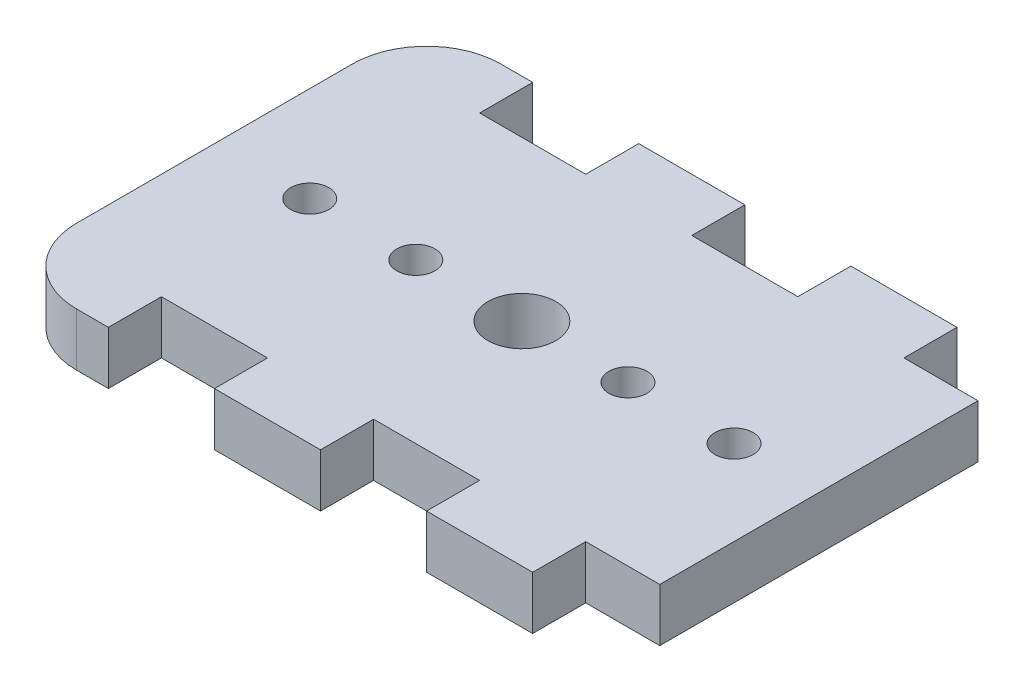
ISO-10303-21;
HEADER;
FILE_DESCRIPTION(('STEP AP214'),'2;1');
FILE_NAME('part.step','',(''),(''),'','','');
FILE_SCHEMA(('AUTOMOTIVE_DESIGN { 1 0 10303 214 1 1 1 1 }'));
ENDSEC;
DATA;
#1=APPLICATION_CONTEXT('core data for automotive mechanical design processes');
#2=APPLICATION_PROTOCOL_DEFINITION('international standard','automotive_design',2000,#1);
#3=PRODUCT_CONTEXT('',#1,'mechanical');
#4=PRODUCT('Part','Part','',(#3));
#5=PRODUCT_RELATED_PRODUCT_CATEGORY('part','',(#4));
#6=PRODUCT_DEFINITION_FORMATION('','',#4);
#7=PRODUCT_DEFINITION_CONTEXT('part definition',#1,'design');
#8=PRODUCT_DEFINITION('design','',#6,#7);
#9=PRODUCT_DEFINITION_SHAPE('','',#8);
#10=(LENGTH_UNIT() NAMED_UNIT(*) SI_UNIT(.MILLI.,.METRE.));
#11=(NAMED_UNIT(*) PLANE_ANGLE_UNIT() SI_UNIT($,.RADIAN.));
#12=(NAMED_UNIT(*) SI_UNIT($,.STERADIAN.) SOLID_ANGLE_UNIT());
#13=UNCERTAINTY_MEASURE_WITH_UNIT(LENGTH_MEASURE(1.E-05),#10,'distance_accuracy_value','');
#14=(GEOMETRIC_REPRESENTATION_CONTEXT(3) GLOBAL_UNCERTAINTY_ASSIGNED_CONTEXT((#13)) GLOBAL_UNIT_ASSIGNED_CONTEXT((#10,
#11,#12)) REPRESENTATION_CONTEXT('',''));
#15=CARTESIAN_POINT('',(0.,0.,0.));
#16=DIRECTION('',(0.,0.,1.));
#17=DIRECTION('',(1.,0.,0.));
#18=AXIS2_PLACEMENT_3D('',#15,#16,#17);
#19=CARTESIAN_POINT('',(-35.1663,6.35,25.4));
#20=DIRECTION('',(0.,0.,-1.));
#21=DIRECTION('',(-1.,0.,0.));
#22=AXIS2_PLACEMENT_3D('',#19,#20,#21);
#23=PLANE('',#22);
#24=DIRECTION('',(1.,0.,0.));
#25=VECTOR('',#24,1.);
#26=CARTESIAN_POINT('',(-35.1663,6.35,25.4));
#27=LINE('',#26,#25);
#28=CARTESIAN_POINT('',(-26.2763,6.35,25.4));
#29=VERTEX_POINT('',#28);
#30=CARTESIAN_POINT('',(-22.4663,6.35,25.4));
#31=VERTEX_POINT('',#30);
#32=EDGE_CURVE('E341',#29,#31,#27,.T.);
#33=ORIENTED_EDGE('',*,*,#32,.F.);
#34=DIRECTION('',(0.,-1.,0.));
#35=VECTOR('',#34,1.);
#36=CARTESIAN_POINT('',(-26.2763,6.35,25.4));
#37=LINE('',#36,#35);
#38=CARTESIAN_POINT('',(-26.2763,0.,25.4));
#39=VERTEX_POINT('',#38);
#40=EDGE_CURVE('E11',#29,#39,#37,.T.);
#41=ORIENTED_EDGE('',*,*,#40,.T.);
#42=DIRECTION('',(1.,0.,0.));
#43=VECTOR('',#42,1.);
#44=CARTESIAN_POINT('',(-35.1663,0.,25.4));
#45=LINE('',#44,#43);
#46=CARTESIAN_POINT('',(-22.4663,0.,25.4));
#47=VERTEX_POINT('',#46);
#48=EDGE_CURVE('E412',#39,#47,#45,.T.);
#49=ORIENTED_EDGE('',*,*,#48,.T.);
#50=DIRECTION('',(0.,-1.,0.));
#51=VECTOR('',#50,1.);
#52=CARTESIAN_POINT('',(-22.4663,6.35,25.4));
#53=LINE('',#52,#51);
#54=EDGE_CURVE('E319',#31,#47,#53,.T.);
#55=ORIENTED_EDGE('',*,*,#54,.F.);
#56=EDGE_LOOP('',(#33,#41,#49,#55));
#57=FACE_BOUND('',#56,.T.);
#58=ADVANCED_FACE('F32',(#57),#23,.F.);
#59=CARTESIAN_POINT('',(-22.4663,6.35,25.4));
#60=DIRECTION('',(-1.,0.,0.));
#61=DIRECTION('',(0.,0.,1.));
#62=AXIS2_PLACEMENT_3D('',#59,#60,#61);
#63=PLANE('',#62);
#64=DIRECTION('',(0.,0.,-1.));
#65=VECTOR('',#64,1.);
#66=CARTESIAN_POINT('',(-22.4663,0.,25.4));
#67=LINE('',#66,#65);
#68=CARTESIAN_POINT('',(-22.4663,0.,19.05));
#69=VERTEX_POINT('',#68);
#70=EDGE_CURVE('E414',#47,#69,#67,.T.);
#71=ORIENTED_EDGE('',*,*,#70,.T.);
#72=DIRECTION('',(0.,-1.,0.));
#73=VECTOR('',#72,1.);
#74=CARTESIAN_POINT('',(-22.4663,6.35,19.05));
#75=LINE('',#74,#73);
#76=CARTESIAN_POINT('',(-22.4663,6.35,19.05));
#77=VERTEX_POINT('',#76);
#78=EDGE_CURVE('E316',#77,#69,#75,.T.);
#79=ORIENTED_EDGE('',*,*,#78,.F.);
#80=DIRECTION('',(0.,0.,-1.));
#81=VECTOR('',#80,1.);
#82=CARTESIAN_POINT('',(-22.4663,6.35,25.4));
#83=LINE('',#82,#81);
#84=EDGE_CURVE('E458',#31,#77,#83,.T.);
#85=ORIENTED_EDGE('',*,*,#84,.F.);
#86=ORIENTED_EDGE('',*,*,#54,.T.);
#87=EDGE_LOOP('',(#71,#79,#85,#86));
#88=FACE_BOUND('',#87,.T.);
#89=ADVANCED_FACE('F527',(#88),#63,.F.);
#90=CARTESIAN_POINT('',(-22.4663,6.35,19.05));
#91=DIRECTION('',(0.,0.,-1.));
#92=DIRECTION('',(-1.,0.,0.));
#93=AXIS2_PLACEMENT_3D('',#90,#91,#92);
#94=PLANE('',#93);
#95=DIRECTION('',(1.,0.,0.));
#96=VECTOR('',#95,1.);
#97=CARTESIAN_POINT('',(-22.4663,0.,19.05));
#98=LINE('',#97,#96);
#99=CARTESIAN_POINT('',(-9.76629999999999,0.,19.05));
#100=VERTEX_POINT('',#99);
#101=EDGE_CURVE('E417',#69,#100,#98,.T.);
#102=ORIENTED_EDGE('',*,*,#101,.T.);
#103=DIRECTION('',(0.,-1.,0.));
#104=VECTOR('',#103,1.);
#105=CARTESIAN_POINT('',(-9.76629999999999,6.35,19.05));
#106=LINE('',#105,#104);
#107=CARTESIAN_POINT('',(-9.76629999999999,6.35,19.05));
#108=VERTEX_POINT('',#107);
#109=EDGE_CURVE('E313',#108,#100,#106,.T.);
#110=ORIENTED_EDGE('',*,*,#109,.F.);
#111=DIRECTION('',(1.,0.,0.));
#112=VECTOR('',#111,1.);
#113=CARTESIAN_POINT('',(-22.4663,6.35,19.05));
#114=LINE('',#113,#112);
#115=EDGE_CURVE('E456',#77,#108,#114,.T.);
#116=ORIENTED_EDGE('',*,*,#115,.F.);
#117=ORIENTED_EDGE('',*,*,#78,.T.);
#118=EDGE_LOOP('',(#102,#110,#116,#117));
#119=FACE_BOUND('',#118,.T.);
#120=ADVANCED_FACE('F533',(#119),#94,.F.);
#121=CARTESIAN_POINT('',(-9.76629999999999,6.35,19.05));
#122=DIRECTION('',(1.,0.,0.));
#123=DIRECTION('',(0.,0.,-1.));
#124=AXIS2_PLACEMENT_3D('',#121,#122,#123);
#125=PLANE('',#124);
#126=DIRECTION('',(0.,0.,1.));
#127=VECTOR('',#126,1.);
#128=CARTESIAN_POINT('',(-9.76629999999999,0.,19.05));
#129=LINE('',#128,#127);
#130=CARTESIAN_POINT('',(-9.76629999999999,0.,25.4));
#131=VERTEX_POINT('',#130);
#132=EDGE_CURVE('E419',#100,#131,#129,.T.);
#133=ORIENTED_EDGE('',*,*,#132,.T.);
#134=DIRECTION('',(0.,-1.,0.));
#135=VECTOR('',#134,1.);
#136=CARTESIAN_POINT('',(-9.76629999999999,6.35,25.4));
#137=LINE('',#136,#135);
#138=CARTESIAN_POINT('',(-9.76629999999999,6.35,25.4));
#139=VERTEX_POINT('',#138);
#140=EDGE_CURVE('E310',#139,#131,#137,.T.);
#141=ORIENTED_EDGE('',*,*,#140,.F.);
#142=DIRECTION('',(0.,0.,1.));
#143=VECTOR('',#142,1.);
#144=CARTESIAN_POINT('',(-9.76629999999999,6.35,19.05));
#145=LINE('',#144,#143);
#146=EDGE_CURVE('E454',#108,#139,#145,.T.);
#147=ORIENTED_EDGE('',*,*,#146,.F.);
#148=ORIENTED_EDGE('',*,*,#109,.T.);
#149=EDGE_LOOP('',(#133,#141,#147,#148));
#150=FACE_BOUND('',#149,.T.);
#151=ADVANCED_FACE('F778',(#150),#125,.F.);
#152=CARTESIAN_POINT('',(-9.76629999999999,6.35,25.4));
#153=DIRECTION('',(0.,0.,-1.));
#154=DIRECTION('',(-1.,0.,0.));
#155=AXIS2_PLACEMENT_3D('',#152,#153,#154);
#156=PLANE('',#155);
#157=DIRECTION('',(1.,0.,0.));
#158=VECTOR('',#157,1.);
#159=CARTESIAN_POINT('',(-9.76629999999999,0.,25.4));
#160=LINE('',#159,#158);
#161=CARTESIAN_POINT('',(2.93370000000001,0.,25.4));
#162=VERTEX_POINT('',#161);
#163=EDGE_CURVE('E421',#131,#162,#160,.T.);
#164=ORIENTED_EDGE('',*,*,#163,.T.);
#165=DIRECTION('',(0.,-1.,0.));
#166=VECTOR('',#165,1.);
#167=CARTESIAN_POINT('',(2.93370000000001,6.35,25.4));
#168=LINE('',#167,#166);
#169=CARTESIAN_POINT('',(2.93370000000001,6.35,25.4));
#170=VERTEX_POINT('',#169);
#171=EDGE_CURVE('E307',#170,#162,#168,.T.);
#172=ORIENTED_EDGE('',*,*,#171,.F.);
#173=DIRECTION('',(1.,0.,0.));
#174=VECTOR('',#173,1.);
#175=CARTESIAN_POINT('',(-9.76629999999999,6.35,25.4));
#176=LINE('',#175,#174);
#177=EDGE_CURVE('E452',#139,#170,#176,.T.);
#178=ORIENTED_EDGE('',*,*,#177,.F.);
#179=ORIENTED_EDGE('',*,*,#140,.T.);
#180=EDGE_LOOP('',(#164,#172,#178,#179));
#181=FACE_BOUND('',#180,.T.);
#182=ADVANCED_FACE('F768',(#181),#156,.F.);
#183=CARTESIAN_POINT('',(2.93370000000001,6.35,25.4));
#184=DIRECTION('',(-1.,0.,0.));
#185=DIRECTION('',(0.,0.,1.));
#186=AXIS2_PLACEMENT_3D('',#183,#184,#185);
#187=PLANE('',#186);
#188=DIRECTION('',(0.,0.,-1.));
#189=VECTOR('',#188,1.);
#190=CARTESIAN_POINT('',(2.93370000000001,0.,25.4));
#191=LINE('',#190,#189);
#192=CARTESIAN_POINT('',(2.93370000000001,0.,19.05));
#193=VERTEX_POINT('',#192);
#194=EDGE_CURVE('E423',#162,#193,#191,.T.);
#195=ORIENTED_EDGE('',*,*,#194,.T.);
#196=DIRECTION('',(0.,-1.,0.));
#197=VECTOR('',#196,1.);
#198=CARTESIAN_POINT('',(2.93370000000001,6.35,19.05));
#199=LINE('',#198,#197);
#200=CARTESIAN_POINT('',(2.93370000000001,6.35,19.05));
#201=VERTEX_POINT('',#200);
#202=EDGE_CURVE('E304',#201,#193,#199,.T.);
#203=ORIENTED_EDGE('',*,*,#202,.F.);
#204=DIRECTION('',(0.,0.,-1.));
#205=VECTOR('',#204,1.);
#206=CARTESIAN_POINT('',(2.93370000000001,6.35,25.4));
#207=LINE('',#206,#205);
#208=EDGE_CURVE('E450',#170,#201,#207,.T.);
#209=ORIENTED_EDGE('',*,*,#208,.F.);
#210=ORIENTED_EDGE('',*,*,#171,.T.);
#211=EDGE_LOOP('',(#195,#203,#209,#210));
#212=FACE_BOUND('',#211,.T.);
#213=ADVANCED_FACE('F758',(#212),#187,.F.);
#214=CARTESIAN_POINT('',(2.93370000000001,6.35,19.05));
#215=DIRECTION('',(0.,0.,-1.));
#216=DIRECTION('',(-1.,0.,0.));
#217=AXIS2_PLACEMENT_3D('',#214,#215,#216);
#218=PLANE('',#217);
#219=DIRECTION('',(1.,0.,0.));
#220=VECTOR('',#219,1.);
#221=CARTESIAN_POINT('',(2.93370000000001,0.,19.05));
#222=LINE('',#221,#220);
#223=CARTESIAN_POINT('',(15.6337,0.,19.05));
#224=VERTEX_POINT('',#223);
#225=EDGE_CURVE('E425',#193,#224,#222,.T.);
#226=ORIENTED_EDGE('',*,*,#225,.T.);
#227=DIRECTION('',(0.,-1.,0.));
#228=VECTOR('',#227,1.);
#229=CARTESIAN_POINT('',(15.6337,6.35,19.05));
#230=LINE('',#229,#228);
#231=CARTESIAN_POINT('',(15.6337,6.35,19.05));
#232=VERTEX_POINT('',#231);
#233=EDGE_CURVE('E301',#232,#224,#230,.T.);
#234=ORIENTED_EDGE('',*,*,#233,.F.);
#235=DIRECTION('',(1.,0.,0.));
#236=VECTOR('',#235,1.);
#237=CARTESIAN_POINT('',(2.93370000000001,6.35,19.05));
#238=LINE('',#237,#236);
#239=EDGE_CURVE('E448',#201,#232,#238,.T.);
#240=ORIENTED_EDGE('',*,*,#239,.F.);
#241=ORIENTED_EDGE('',*,*,#202,.T.);
#242=EDGE_LOOP('',(#226,#234,#240,#241));
#243=FACE_BOUND('',#242,.T.);
#244=ADVANCED_FACE('F748',(#243),#218,.F.);
#245=CARTESIAN_POINT('',(15.6337,6.35,19.05));
#246=DIRECTION('',(1.,0.,0.));
#247=DIRECTION('',(0.,0.,-1.));
#248=AXIS2_PLACEMENT_3D('',#245,#246,#247);
#249=PLANE('',#248);
#250=DIRECTION('',(0.,0.,1.));
#251=VECTOR('',#250,1.);
#252=CARTESIAN_POINT('',(15.6337,0.,19.05));
#253=LINE('',#252,#251);
#254=CARTESIAN_POINT('',(15.6337,0.,25.4));
#255=VERTEX_POINT('',#254);
#256=EDGE_CURVE('E427',#224,#255,#253,.T.);
#257=ORIENTED_EDGE('',*,*,#256,.T.);
#258=DIRECTION('',(0.,-1.,0.));
#259=VECTOR('',#258,1.);
#260=CARTESIAN_POINT('',(15.6337,6.35,25.4));
#261=LINE('',#260,#259);
#262=CARTESIAN_POINT('',(15.6337,6.35,25.4));
#263=VERTEX_POINT('',#262);
#264=EDGE_CURVE('E298',#263,#255,#261,.T.);
#265=ORIENTED_EDGE('',*,*,#264,.F.);
#266=DIRECTION('',(0.,0.,1.));
#267=VECTOR('',#266,1.);
#268=CARTESIAN_POINT('',(15.6337,6.35,19.05));
#269=LINE('',#268,#267);
#270=EDGE_CURVE('E446',#232,#263,#269,.T.);
#271=ORIENTED_EDGE('',*,*,#270,.F.);
#272=ORIENTED_EDGE('',*,*,#233,.T.);
#273=EDGE_LOOP('',(#257,#265,#271,#272));
#274=FACE_BOUND('',#273,.T.);
#275=ADVANCED_FACE('F738',(#274),#249,.F.);
#276=CARTESIAN_POINT('',(15.6337,6.35,25.4));
#277=DIRECTION('',(0.,0.,-1.));
#278=DIRECTION('',(-1.,0.,0.));
#279=AXIS2_PLACEMENT_3D('',#276,#277,#278);
#280=PLANE('',#279);
#281=DIRECTION('',(1.,0.,0.));
#282=VECTOR('',#281,1.);
#283=CARTESIAN_POINT('',(15.6337,0.,25.4));
#284=LINE('',#283,#282);
#285=CARTESIAN_POINT('',(28.3337,0.,25.4));
#286=VERTEX_POINT('',#285);
#287=EDGE_CURVE('E429',#255,#286,#284,.T.);
#288=ORIENTED_EDGE('',*,*,#287,.T.);
#289=DIRECTION('',(0.,-1.,0.));
#290=VECTOR('',#289,1.);
#291=CARTESIAN_POINT('',(28.3337,6.35,25.4));
#292=LINE('',#291,#290);
#293=CARTESIAN_POINT('',(28.3337,6.35,25.4));
#294=VERTEX_POINT('',#293);
#295=EDGE_CURVE('E295',#294,#286,#292,.T.);
#296=ORIENTED_EDGE('',*,*,#295,.F.);
#297=DIRECTION('',(1.,0.,0.));
#298=VECTOR('',#297,1.);
#299=CARTESIAN_POINT('',(15.6337,6.35,25.4));
#300=LINE('',#299,#298);
#301=EDGE_CURVE('E442',#263,#294,#300,.T.);
#302=ORIENTED_EDGE('',*,*,#301,.F.);
#303=ORIENTED_EDGE('',*,*,#264,.T.);
#304=EDGE_LOOP('',(#288,#296,#302,#303));
#305=FACE_BOUND('',#304,.T.);
#306=ADVANCED_FACE('F729',(#305),#280,.F.);
#307=CARTESIAN_POINT('',(28.3337,6.35,25.4));
#308=DIRECTION('',(-1.,0.,0.));
#309=DIRECTION('',(0.,0.,1.));
#310=AXIS2_PLACEMENT_3D('',#307,#308,#309);
#311=PLANE('',#310);
#312=DIRECTION('',(0.,0.,-1.));
#313=VECTOR('',#312,1.);
#314=CARTESIAN_POINT('',(28.3337,0.,25.4));
#315=LINE('',#314,#313);
#316=CARTESIAN_POINT('',(28.3337,0.,19.05));
#317=VERTEX_POINT('',#316);
#318=EDGE_CURVE('E237',#286,#317,#315,.T.);
#319=ORIENTED_EDGE('',*,*,#318,.T.);
#320=DIRECTION('',(0.,-1.,0.));
#321=VECTOR('',#320,1.);
#322=CARTESIAN_POINT('',(28.3337,6.35,19.05));
#323=LINE('',#322,#321);
#324=CARTESIAN_POINT('',(28.3337,6.35,19.05));
#325=VERTEX_POINT('',#324);
#326=EDGE_CURVE('E292',#325,#317,#323,.T.);
#327=ORIENTED_EDGE('',*,*,#326,.F.);
#328=DIRECTION('',(0.,0.,-1.));
#329=VECTOR('',#328,1.);
#330=CARTESIAN_POINT('',(28.3337,6.35,25.4));
#331=LINE('',#330,#329);
#332=EDGE_CURVE('E441',#294,#325,#331,.T.);
#333=ORIENTED_EDGE('',*,*,#332,.F.);
#334=ORIENTED_EDGE('',*,*,#295,.T.);
#335=EDGE_LOOP('',(#319,#327,#333,#334));
#336=FACE_BOUND('',#335,.T.);
#337=ADVANCED_FACE('F433',(#336),#311,.F.);
#338=CARTESIAN_POINT('',(28.3337,6.35,19.05));
#339=DIRECTION('',(0.,0.,-1.));
#340=DIRECTION('',(-1.,0.,0.));
#341=AXIS2_PLACEMENT_3D('',#338,#339,#340);
#342=PLANE('',#341);
#343=DIRECTION('',(1.,0.,0.));
#344=VECTOR('',#343,1.);
#345=CARTESIAN_POINT('',(28.3337,0.,19.05));
#346=LINE('',#345,#344);
#347=CARTESIAN_POINT('',(37.2015848526174,0.,19.05));
#348=VERTEX_POINT('',#347);
#349=EDGE_CURVE('E233',#317,#348,#346,.T.);
#350=ORIENTED_EDGE('',*,*,#349,.T.);
#351=DIRECTION('',(0.,1.,0.));
#352=VECTOR('',#351,1.);
#353=CARTESIAN_POINT('',(37.2015848526174,0.,19.05));
#354=LINE('',#353,#352);
#355=CARTESIAN_POINT('',(37.2015848526174,6.35,19.05));
#356=VERTEX_POINT('',#355);
#357=EDGE_CURVE('E213',#348,#356,#354,.T.);
#358=ORIENTED_EDGE('',*,*,#357,.T.);
#359=DIRECTION('',(1.,0.,0.));
#360=VECTOR('',#359,1.);
#361=CARTESIAN_POINT('',(28.3337,6.35,19.05));
#362=LINE('',#361,#360);
#363=EDGE_CURVE('E400',#325,#356,#362,.T.);
#364=ORIENTED_EDGE('',*,*,#363,.F.);
#365=ORIENTED_EDGE('',*,*,#326,.T.);
#366=EDGE_LOOP('',(#350,#358,#364,#365));
#367=FACE_BOUND('',#366,.T.);
#368=ADVANCED_FACE('F439',(#367),#342,.F.);
#369=CARTESIAN_POINT('',(28.3337,6.35,-19.05));
#370=DIRECTION('',(0.,0.,1.));
#371=DIRECTION('',(1.,0.,0.));
#372=AXIS2_PLACEMENT_3D('',#369,#370,#371);
#373=PLANE('',#372);
#374=DIRECTION('',(-1.,0.,0.));
#375=VECTOR('',#374,1.);
#376=CARTESIAN_POINT('',(28.3337,6.35,-19.05));
#377=LINE('',#376,#375);
#378=CARTESIAN_POINT('',(37.2015848526174,6.35,-19.05));
#379=VERTEX_POINT('',#378);
#380=CARTESIAN_POINT('',(28.3337,6.35,-19.05));
#381=VERTEX_POINT('',#380);
#382=EDGE_CURVE('E226',#379,#381,#377,.T.);
#383=ORIENTED_EDGE('',*,*,#382,.F.);
#384=DIRECTION('',(0.,1.,0.));
#385=VECTOR('',#384,1.);
#386=CARTESIAN_POINT('',(37.2015848526174,0.,-19.05));
#387=LINE('',#386,#385);
#388=CARTESIAN_POINT('',(37.2015848526174,0.,-19.05));
#389=VERTEX_POINT('',#388);
#390=EDGE_CURVE('E210',#389,#379,#387,.T.);
#391=ORIENTED_EDGE('',*,*,#390,.F.);
#392=DIRECTION('',(-1.,0.,0.));
#393=VECTOR('',#392,1.);
#394=CARTESIAN_POINT('',(28.3337,0.,-19.05));
#395=LINE('',#394,#393);
#396=CARTESIAN_POINT('',(28.3337,0.,-19.05));
#397=VERTEX_POINT('',#396);
#398=EDGE_CURVE('E224',#389,#397,#395,.T.);
#399=ORIENTED_EDGE('',*,*,#398,.T.);
#400=DIRECTION('',(0.,-1.,0.));
#401=VECTOR('',#400,1.);
#402=CARTESIAN_POINT('',(28.3337,6.35,-19.05));
#403=LINE('',#402,#401);
#404=EDGE_CURVE('E290',#381,#397,#403,.T.);
#405=ORIENTED_EDGE('',*,*,#404,.F.);
#406=EDGE_LOOP('',(#383,#391,#399,#405));
#407=FACE_BOUND('',#406,.T.);
#408=ADVANCED_FACE('F222',(#407),#373,.F.);
#409=CARTESIAN_POINT('',(28.3337,6.35,-25.4));
#410=DIRECTION('',(-1.,0.,0.));
#411=DIRECTION('',(0.,0.,1.));
#412=AXIS2_PLACEMENT_3D('',#409,#410,#411);
#413=PLANE('',#412);
#414=DIRECTION('',(0.,0.,-1.));
#415=VECTOR('',#414,1.);
#416=CARTESIAN_POINT('',(28.3337,0.,-25.4));
#417=LINE('',#416,#415);
#418=CARTESIAN_POINT('',(28.3337,0.,-25.4));
#419=VERTEX_POINT('',#418);
#420=EDGE_CURVE('E232',#397,#419,#417,.T.);
#421=ORIENTED_EDGE('',*,*,#420,.T.);
#422=DIRECTION('',(0.,-1.,0.));
#423=VECTOR('',#422,1.);
#424=CARTESIAN_POINT('',(28.3337,6.35,-25.4));
#425=LINE('',#424,#423);
#426=CARTESIAN_POINT('',(28.3337,6.35,-25.4));
#427=VERTEX_POINT('',#426);
#428=EDGE_CURVE('E287',#427,#419,#425,.T.);
#429=ORIENTED_EDGE('',*,*,#428,.F.);
#430=DIRECTION('',(0.,0.,-1.));
#431=VECTOR('',#430,1.);
#432=CARTESIAN_POINT('',(28.3337,6.35,-25.4));
#433=LINE('',#432,#431);
#434=EDGE_CURVE('E397',#381,#427,#433,.T.);
#435=ORIENTED_EDGE('',*,*,#434,.F.);
#436=ORIENTED_EDGE('',*,*,#404,.T.);
#437=EDGE_LOOP('',(#421,#429,#435,#436));
#438=FACE_BOUND('',#437,.T.);
#439=ADVANCED_FACE('F396',(#438),#413,.F.);
#440=CARTESIAN_POINT('',(15.6337,6.35,-25.4));
#441=DIRECTION('',(0.,0.,1.));
#442=DIRECTION('',(1.,0.,0.));
#443=AXIS2_PLACEMENT_3D('',#440,#441,#442);
#444=PLANE('',#443);
#445=DIRECTION('',(-1.,0.,0.));
#446=VECTOR('',#445,1.);
#447=CARTESIAN_POINT('',(15.6337,0.,-25.4));
#448=LINE('',#447,#446);
#449=CARTESIAN_POINT('',(15.6337,0.,-25.4));
#450=VERTEX_POINT('',#449);
#451=EDGE_CURVE('E235',#419,#450,#448,.T.);
#452=ORIENTED_EDGE('',*,*,#451,.T.);
#453=DIRECTION('',(0.,-1.,0.));
#454=VECTOR('',#453,1.);
#455=CARTESIAN_POINT('',(15.6337,6.35,-25.4));
#456=LINE('',#455,#454);
#457=CARTESIAN_POINT('',(15.6337,6.35,-25.4));
#458=VERTEX_POINT('',#457);
#459=EDGE_CURVE('E284',#458,#450,#456,.T.);
#460=ORIENTED_EDGE('',*,*,#459,.F.);
#461=DIRECTION('',(-1.,0.,0.));
#462=VECTOR('',#461,1.);
#463=CARTESIAN_POINT('',(15.6337,6.35,-25.4));
#464=LINE('',#463,#462);
#465=EDGE_CURVE('E393',#427,#458,#464,.T.);
#466=ORIENTED_EDGE('',*,*,#465,.F.);
#467=ORIENTED_EDGE('',*,*,#428,.T.);
#468=EDGE_LOOP('',(#452,#460,#466,#467));
#469=FACE_BOUND('',#468,.T.);
#470=ADVANCED_FACE('F390',(#469),#444,.F.);
#471=CARTESIAN_POINT('',(15.6337,6.35,-19.05));
#472=DIRECTION('',(1.,0.,0.));
#473=DIRECTION('',(0.,0.,-1.));
#474=AXIS2_PLACEMENT_3D('',#471,#472,#473);
#475=PLANE('',#474);
#476=DIRECTION('',(0.,0.,1.));
#477=VECTOR('',#476,1.);
#478=CARTESIAN_POINT('',(15.6337,0.,-19.05));
#479=LINE('',#478,#477);
#480=CARTESIAN_POINT('',(15.6337,0.,-19.05));
#481=VERTEX_POINT('',#480);
#482=EDGE_CURVE('E242',#450,#481,#479,.T.);
#483=ORIENTED_EDGE('',*,*,#482,.T.);
#484=DIRECTION('',(0.,-1.,0.));
#485=VECTOR('',#484,1.);
#486=CARTESIAN_POINT('',(15.6337,6.35,-19.05));
#487=LINE('',#486,#485);
#488=CARTESIAN_POINT('',(15.6337,6.35,-19.05));
#489=VERTEX_POINT('',#488);
#490=EDGE_CURVE('E281',#489,#481,#487,.T.);
#491=ORIENTED_EDGE('',*,*,#490,.F.);
#492=DIRECTION('',(0.,0.,1.));
#493=VECTOR('',#492,1.);
#494=CARTESIAN_POINT('',(15.6337,6.35,-19.05));
#495=LINE('',#494,#493);
#496=EDGE_CURVE('E387',#458,#489,#495,.T.);
#497=ORIENTED_EDGE('',*,*,#496,.F.);
#498=ORIENTED_EDGE('',*,*,#459,.T.);
#499=EDGE_LOOP('',(#483,#491,#497,#498));
#500=FACE_BOUND('',#499,.T.);
#501=ADVANCED_FACE('F386',(#500),#475,.F.);
#502=CARTESIAN_POINT('',(2.93370000000001,6.35,-19.05));
#503=DIRECTION('',(0.,0.,1.));
#504=DIRECTION('',(1.,0.,0.));
#505=AXIS2_PLACEMENT_3D('',#502,#503,#504);
#506=PLANE('',#505);
#507=DIRECTION('',(-1.,0.,0.));
#508=VECTOR('',#507,1.);
#509=CARTESIAN_POINT('',(2.93370000000001,0.,-19.05));
#510=LINE('',#509,#508);
#511=CARTESIAN_POINT('',(2.93370000000001,0.,-19.05));
#512=VERTEX_POINT('',#511);
#513=EDGE_CURVE('E244',#481,#512,#510,.T.);
#514=ORIENTED_EDGE('',*,*,#513,.T.);
#515=DIRECTION('',(0.,-1.,0.));
#516=VECTOR('',#515,1.);
#517=CARTESIAN_POINT('',(2.93370000000001,6.35,-19.05));
#518=LINE('',#517,#516);
#519=CARTESIAN_POINT('',(2.93370000000001,6.35,-19.05));
#520=VERTEX_POINT('',#519);
#521=EDGE_CURVE('E278',#520,#512,#518,.T.);
#522=ORIENTED_EDGE('',*,*,#521,.F.);
#523=DIRECTION('',(-1.,0.,0.));
#524=VECTOR('',#523,1.);
#525=CARTESIAN_POINT('',(2.93370000000001,6.35,-19.05));
#526=LINE('',#525,#524);
#527=EDGE_CURVE('E382',#489,#520,#526,.T.);
#528=ORIENTED_EDGE('',*,*,#527,.F.);
#529=ORIENTED_EDGE('',*,*,#490,.T.);
#530=EDGE_LOOP('',(#514,#522,#528,#529));
#531=FACE_BOUND('',#530,.T.);
#532=ADVANCED_FACE('F381',(#531),#506,.F.);
#533=CARTESIAN_POINT('',(2.93370000000001,6.35,-25.4));
#534=DIRECTION('',(-1.,0.,0.));
#535=DIRECTION('',(0.,0.,1.));
#536=AXIS2_PLACEMENT_3D('',#533,#534,#535);
#537=PLANE('',#536);
#538=DIRECTION('',(0.,0.,-1.));
#539=VECTOR('',#538,1.);
#540=CARTESIAN_POINT('',(2.93370000000001,0.,-25.4));
#541=LINE('',#540,#539);
#542=CARTESIAN_POINT('',(2.93370000000001,0.,-25.4));
#543=VERTEX_POINT('',#542);
#544=EDGE_CURVE('E246',#512,#543,#541,.T.);
#545=ORIENTED_EDGE('',*,*,#544,.T.);
#546=DIRECTION('',(0.,-1.,0.));
#547=VECTOR('',#546,1.);
#548=CARTESIAN_POINT('',(2.93370000000001,6.35,-25.4));
#549=LINE('',#548,#547);
#550=CARTESIAN_POINT('',(2.93370000000001,6.35,-25.4));
#551=VERTEX_POINT('',#550);
#552=EDGE_CURVE('E275',#551,#543,#549,.T.);
#553=ORIENTED_EDGE('',*,*,#552,.F.);
#554=DIRECTION('',(0.,0.,-1.));
#555=VECTOR('',#554,1.);
#556=CARTESIAN_POINT('',(2.93370000000001,6.35,-25.4));
#557=LINE('',#556,#555);
#558=EDGE_CURVE('E378',#520,#551,#557,.T.);
#559=ORIENTED_EDGE('',*,*,#558,.F.);
#560=ORIENTED_EDGE('',*,*,#521,.T.);
#561=EDGE_LOOP('',(#545,#553,#559,#560));
#562=FACE_BOUND('',#561,.T.);
#563=ADVANCED_FACE('F375',(#562),#537,.F.);
#564=CARTESIAN_POINT('',(-9.76629999999999,6.35,-25.4));
#565=DIRECTION('',(0.,0.,1.));
#566=DIRECTION('',(1.,0.,0.));
#567=AXIS2_PLACEMENT_3D('',#564,#565,#566);
#568=PLANE('',#567);
#569=DIRECTION('',(-1.,0.,0.));
#570=VECTOR('',#569,1.);
#571=CARTESIAN_POINT('',(-9.76629999999999,0.,-25.4));
#572=LINE('',#571,#570);
#573=CARTESIAN_POINT('',(-9.76629999999999,0.,-25.4));
#574=VERTEX_POINT('',#573);
#575=EDGE_CURVE('E248',#543,#574,#572,.T.);
#576=ORIENTED_EDGE('',*,*,#575,.T.);
#577=DIRECTION('',(0.,-1.,0.));
#578=VECTOR('',#577,1.);
#579=CARTESIAN_POINT('',(-9.76629999999999,6.35,-25.4));
#580=LINE('',#579,#578);
#581=CARTESIAN_POINT('',(-9.76629999999999,6.35,-25.4));
#582=VERTEX_POINT('',#581);
#583=EDGE_CURVE('E272',#582,#574,#580,.T.);
#584=ORIENTED_EDGE('',*,*,#583,.F.);
#585=DIRECTION('',(-1.,0.,0.));
#586=VECTOR('',#585,1.);
#587=CARTESIAN_POINT('',(-9.76629999999999,6.35,-25.4));
#588=LINE('',#587,#586);
#589=EDGE_CURVE('E369',#551,#582,#588,.T.);
#590=ORIENTED_EDGE('',*,*,#589,.F.);
#591=ORIENTED_EDGE('',*,*,#552,.T.);
#592=EDGE_LOOP('',(#576,#584,#590,#591));
#593=FACE_BOUND('',#592,.T.);
#594=ADVANCED_FACE('F368',(#593),#568,.F.);
#595=CARTESIAN_POINT('',(-9.76629999999999,6.35,-19.05));
#596=DIRECTION('',(1.,0.,0.));
#597=DIRECTION('',(0.,0.,-1.));
#598=AXIS2_PLACEMENT_3D('',#595,#596,#597);
#599=PLANE('',#598);
#600=DIRECTION('',(0.,0.,1.));
#601=VECTOR('',#600,1.);
#602=CARTESIAN_POINT('',(-9.76629999999999,0.,-19.05));
#603=LINE('',#602,#601);
#604=CARTESIAN_POINT('',(-9.76629999999999,0.,-19.05));
#605=VERTEX_POINT('',#604);
#606=EDGE_CURVE('E250',#574,#605,#603,.T.);
#607=ORIENTED_EDGE('',*,*,#606,.T.);
#608=DIRECTION('',(0.,-1.,0.));
#609=VECTOR('',#608,1.);
#610=CARTESIAN_POINT('',(-9.76629999999999,6.35,-19.05));
#611=LINE('',#610,#609);
#612=CARTESIAN_POINT('',(-9.76629999999999,6.35,-19.05));
#613=VERTEX_POINT('',#612);
#614=EDGE_CURVE('E269',#613,#605,#611,.T.);
#615=ORIENTED_EDGE('',*,*,#614,.F.);
#616=DIRECTION('',(0.,0.,1.));
#617=VECTOR('',#616,1.);
#618=CARTESIAN_POINT('',(-9.76629999999999,6.35,-19.05));
#619=LINE('',#618,#617);
#620=EDGE_CURVE('E364',#582,#613,#619,.T.);
#621=ORIENTED_EDGE('',*,*,#620,.F.);
#622=ORIENTED_EDGE('',*,*,#583,.T.);
#623=EDGE_LOOP('',(#607,#615,#621,#622));
#624=FACE_BOUND('',#623,.T.);
#625=ADVANCED_FACE('F363',(#624),#599,.F.);
#626=CARTESIAN_POINT('',(-22.4663,6.35,-19.05));
#627=DIRECTION('',(0.,0.,1.));
#628=DIRECTION('',(1.,0.,0.));
#629=AXIS2_PLACEMENT_3D('',#626,#627,#628);
#630=PLANE('',#629);
#631=DIRECTION('',(-1.,0.,0.));
#632=VECTOR('',#631,1.);
#633=CARTESIAN_POINT('',(-22.4663,0.,-19.05));
#634=LINE('',#633,#632);
#635=CARTESIAN_POINT('',(-22.4663,0.,-19.05));
#636=VERTEX_POINT('',#635);
#637=EDGE_CURVE('E252',#605,#636,#634,.T.);
#638=ORIENTED_EDGE('',*,*,#637,.T.);
#639=DIRECTION('',(0.,-1.,0.));
#640=VECTOR('',#639,1.);
#641=CARTESIAN_POINT('',(-22.4663,6.35,-19.05));
#642=LINE('',#641,#640);
#643=CARTESIAN_POINT('',(-22.4663,6.35,-19.05));
#644=VERTEX_POINT('',#643);
#645=EDGE_CURVE('E265',#644,#636,#642,.T.);
#646=ORIENTED_EDGE('',*,*,#645,.F.);
#647=DIRECTION('',(-1.,0.,0.));
#648=VECTOR('',#647,1.);
#649=CARTESIAN_POINT('',(-22.4663,6.35,-19.05));
#650=LINE('',#649,#648);
#651=EDGE_CURVE('E360',#613,#644,#650,.T.);
#652=ORIENTED_EDGE('',*,*,#651,.F.);
#653=ORIENTED_EDGE('',*,*,#614,.T.);
#654=EDGE_LOOP('',(#638,#646,#652,#653));
#655=FACE_BOUND('',#654,.T.);
#656=ADVANCED_FACE('F357',(#655),#630,.F.);
#657=CARTESIAN_POINT('',(-22.4663,6.35,-25.4));
#658=DIRECTION('',(-1.,0.,0.));
#659=DIRECTION('',(0.,0.,1.));
#660=AXIS2_PLACEMENT_3D('',#657,#658,#659);
#661=PLANE('',#660);
#662=DIRECTION('',(0.,0.,-1.));
#663=VECTOR('',#662,1.);
#664=CARTESIAN_POINT('',(-22.4663,0.,-25.4));
#665=LINE('',#664,#663);
#666=CARTESIAN_POINT('',(-22.4663,0.,-25.4));
#667=VERTEX_POINT('',#666);
#668=EDGE_CURVE('E254',#636,#667,#665,.T.);
#669=ORIENTED_EDGE('',*,*,#668,.T.);
#670=DIRECTION('',(0.,-1.,0.));
#671=VECTOR('',#670,1.);
#672=CARTESIAN_POINT('',(-22.4663,6.35,-25.4));
#673=LINE('',#672,#671);
#674=CARTESIAN_POINT('',(-22.4663,6.35,-25.4));
#675=VERTEX_POINT('',#674);
#676=EDGE_CURVE('E262',#675,#667,#673,.T.);
#677=ORIENTED_EDGE('',*,*,#676,.F.);
#678=DIRECTION('',(0.,0.,-1.));
#679=VECTOR('',#678,1.);
#680=CARTESIAN_POINT('',(-22.4663,6.35,-25.4));
#681=LINE('',#680,#679);
#682=EDGE_CURVE('E351',#644,#675,#681,.T.);
#683=ORIENTED_EDGE('',*,*,#682,.F.);
#684=ORIENTED_EDGE('',*,*,#645,.T.);
#685=EDGE_LOOP('',(#669,#677,#683,#684));
#686=FACE_BOUND('',#685,.T.);
#687=ADVANCED_FACE('F350',(#686),#661,.F.);
#688=CARTESIAN_POINT('',(-35.1663,6.35,-25.4));
#689=DIRECTION('',(0.,0.,1.));
#690=DIRECTION('',(1.,0.,0.));
#691=AXIS2_PLACEMENT_3D('',#688,#689,#690);
#692=PLANE('',#691);
#693=DIRECTION('',(-1.,0.,0.));
#694=VECTOR('',#693,1.);
#695=CARTESIAN_POINT('',(-35.1663,0.,-25.4));
#696=LINE('',#695,#694);
#697=CARTESIAN_POINT('',(-26.2763,0.,-25.4));
#698=VERTEX_POINT('',#697);
#699=EDGE_CURVE('E256',#667,#698,#696,.T.);
#700=ORIENTED_EDGE('',*,*,#699,.T.);
#701=DIRECTION('',(0.,-1.,0.));
#702=VECTOR('',#701,1.);
#703=CARTESIAN_POINT('',(-26.2763,6.35,-25.4));
#704=LINE('',#703,#702);
#705=CARTESIAN_POINT('',(-26.2763,6.35,-25.4));
#706=VERTEX_POINT('',#705);
#707=EDGE_CURVE('E55',#698,#706,#704,.F.);
#708=ORIENTED_EDGE('',*,*,#707,.T.);
#709=DIRECTION('',(-1.,0.,0.));
#710=VECTOR('',#709,1.);
#711=CARTESIAN_POINT('',(-35.1663,6.35,-25.4));
#712=LINE('',#711,#710);
#713=EDGE_CURVE('E266',#675,#706,#712,.T.);
#714=ORIENTED_EDGE('',*,*,#713,.F.);
#715=ORIENTED_EDGE('',*,*,#676,.T.);
#716=EDGE_LOOP('',(#700,#708,#714,#715));
#717=FACE_BOUND('',#716,.T.);
#718=ADVANCED_FACE('F346',(#717),#692,.F.);
#719=CARTESIAN_POINT('',(-35.1663,6.35,-19.05));
#720=DIRECTION('',(1.,0.,0.));
#721=DIRECTION('',(0.,0.,-1.));
#722=AXIS2_PLACEMENT_3D('',#719,#720,#721);
#723=PLANE('',#722);
#724=DIRECTION('',(0.,0.,1.));
#725=VECTOR('',#724,1.);
#726=CARTESIAN_POINT('',(-35.1663,6.35,19.05));
#727=LINE('',#726,#725);
#728=CARTESIAN_POINT('',(-35.1663,6.35,-16.51));
#729=VERTEX_POINT('',#728);
#730=CARTESIAN_POINT('',(-35.1663,6.35,16.51));
#731=VERTEX_POINT('',#730);
#732=EDGE_CURVE('E261',#729,#731,#727,.T.);
#733=ORIENTED_EDGE('',*,*,#732,.F.);
#734=DIRECTION('',(0.,-1.,0.));
#735=VECTOR('',#734,1.);
#736=CARTESIAN_POINT('',(-35.1663,6.35,-16.51));
#737=LINE('',#736,#735);
#738=CARTESIAN_POINT('',(-35.1663,0.,-16.51));
#739=VERTEX_POINT('',#738);
#740=EDGE_CURVE('E324',#729,#739,#737,.T.);
#741=ORIENTED_EDGE('',*,*,#740,.T.);
#742=DIRECTION('',(0.,0.,1.));
#743=VECTOR('',#742,1.);
#744=CARTESIAN_POINT('',(-35.1663,0.,-19.05));
#745=LINE('',#744,#743);
#746=CARTESIAN_POINT('',(-35.1663,0.,16.51));
#747=VERTEX_POINT('',#746);
#748=EDGE_CURVE('E258',#739,#747,#745,.T.);
#749=ORIENTED_EDGE('',*,*,#748,.T.);
#750=DIRECTION('',(0.,-1.,0.));
#751=VECTOR('',#750,1.);
#752=CARTESIAN_POINT('',(-35.1663,6.35,16.51));
#753=LINE('',#752,#751);
#754=EDGE_CURVE('E322',#747,#731,#753,.F.);
#755=ORIENTED_EDGE('',*,*,#754,.T.);
#756=EDGE_LOOP('',(#733,#741,#749,#755));
#757=FACE_BOUND('',#756,.T.);
#758=ADVANCED_FACE('F339',(#757),#723,.F.);
#759=CARTESIAN_POINT('',(0.,6.35,0.));
#760=DIRECTION('',(0.,1.,0.));
#761=DIRECTION('',(0.,0.,1.));
#762=AXIS2_PLACEMENT_3D('',#759,#760,#761);
#763=PLANE('',#762);
#764=ORIENTED_EDGE('',*,*,#713,.T.);
#765=CARTESIAN_POINT('',(-26.2763,6.35,-16.51));
#766=DIRECTION('',(0.,1.,0.));
#767=DIRECTION('',(0.,0.,1.));
#768=AXIS2_PLACEMENT_3D('',#765,#766,#767);
#769=CIRCLE('',#768,8.89);
#770=EDGE_CURVE('E40',#706,#729,#769,.T.);
#771=ORIENTED_EDGE('',*,*,#770,.T.);
#772=ORIENTED_EDGE('',*,*,#732,.T.);
#773=CARTESIAN_POINT('',(-26.2763,6.35,16.51));
#774=DIRECTION('',(0.,1.,0.));
#775=DIRECTION('',(0.,0.,1.));
#776=AXIS2_PLACEMENT_3D('',#773,#774,#775);
#777=CIRCLE('',#776,8.89);
#778=EDGE_CURVE('E47',#731,#29,#777,.T.);
#779=ORIENTED_EDGE('',*,*,#778,.T.);
#780=ORIENTED_EDGE('',*,*,#32,.T.);
#781=ORIENTED_EDGE('',*,*,#84,.T.);
#782=ORIENTED_EDGE('',*,*,#115,.T.);
#783=ORIENTED_EDGE('',*,*,#146,.T.);
#784=ORIENTED_EDGE('',*,*,#177,.T.);
#785=ORIENTED_EDGE('',*,*,#208,.T.);
#786=ORIENTED_EDGE('',*,*,#239,.T.);
#787=ORIENTED_EDGE('',*,*,#270,.T.);
#788=ORIENTED_EDGE('',*,*,#301,.T.);
#789=ORIENTED_EDGE('',*,*,#332,.T.);
#790=ORIENTED_EDGE('',*,*,#363,.T.);
#791=DIRECTION('',(0.,0.,1.));
#792=VECTOR('',#791,1.);
#793=CARTESIAN_POINT('',(37.2015848526174,6.35,-19.05));
#794=LINE('',#793,#792);
#795=EDGE_CURVE('E218',#379,#356,#794,.T.);
#796=ORIENTED_EDGE('',*,*,#795,.F.);
#797=ORIENTED_EDGE('',*,*,#382,.T.);
#798=ORIENTED_EDGE('',*,*,#434,.T.);
#799=ORIENTED_EDGE('',*,*,#465,.T.);
#800=ORIENTED_EDGE('',*,*,#496,.T.);
#801=ORIENTED_EDGE('',*,*,#527,.T.);
#802=ORIENTED_EDGE('',*,*,#558,.T.);
#803=ORIENTED_EDGE('',*,*,#589,.T.);
#804=ORIENTED_EDGE('',*,*,#620,.T.);
#805=ORIENTED_EDGE('',*,*,#651,.T.);
#806=ORIENTED_EDGE('',*,*,#682,.T.);
#807=EDGE_LOOP('',(#764,#771,#772,#779,#780,#781,#782,#783,#784,#785,#786,#787,#788,#789,#790,
#796,#797,#798,#799,#800,#801,#802,#803,#804,#805,#806));
#808=FACE_BOUND('',#807,.T.);
#809=CARTESIAN_POINT('',(-23.7584151473826,6.35,0.));
#810=DIRECTION('',(0.,1.,0.));
#811=DIRECTION('',(0.,0.,1.));
#812=AXIS2_PLACEMENT_3D('',#809,#810,#811);
#813=CIRCLE('',#812,2.286);
#814=CARTESIAN_POINT('',(-23.7584151473826,6.35,2.286));
#815=VERTEX_POINT('',#814);
#816=EDGE_CURVE('E485',#815,#815,#813,.T.);
#817=ORIENTED_EDGE('',*,*,#816,.F.);
#818=EDGE_LOOP('',(#817));
#819=FACE_BOUND('',#818,.T.);
#820=CARTESIAN_POINT('',(-11.0584151473826,6.35,0.));
#821=DIRECTION('',(0.,1.,0.));
#822=DIRECTION('',(0.,0.,1.));
#823=AXIS2_PLACEMENT_3D('',#820,#821,#822);
#824=CIRCLE('',#823,2.286);
#825=CARTESIAN_POINT('',(-11.0584151473826,6.35,2.286));
#826=VERTEX_POINT('',#825);
#827=EDGE_CURVE('E479',#826,#826,#824,.T.);
#828=ORIENTED_EDGE('',*,*,#827,.F.);
#829=EDGE_LOOP('',(#828));
#830=FACE_BOUND('',#829,.T.);
#831=CARTESIAN_POINT('',(27.0415848526174,6.35,0.));
#832=DIRECTION('',(0.,1.,0.));
#833=DIRECTION('',(0.,0.,1.));
#834=AXIS2_PLACEMENT_3D('',#831,#832,#833);
#835=CIRCLE('',#834,2.286);
#836=CARTESIAN_POINT('',(27.0415848526174,6.35,2.286));
#837=VERTEX_POINT('',#836);
#838=EDGE_CURVE('E473',#837,#837,#835,.T.);
#839=ORIENTED_EDGE('',*,*,#838,.F.);
#840=EDGE_LOOP('',(#839));
#841=FACE_BOUND('',#840,.T.);
#842=CARTESIAN_POINT('',(14.3415848526174,6.35,0.));
#843=DIRECTION('',(0.,1.,0.));
#844=DIRECTION('',(0.,0.,1.));
#845=AXIS2_PLACEMENT_3D('',#842,#843,#844);
#846=CIRCLE('',#845,2.286);
#847=CARTESIAN_POINT('',(14.3415848526174,6.35,2.286));
#848=VERTEX_POINT('',#847);
#849=EDGE_CURVE('E467',#848,#848,#846,.T.);
#850=ORIENTED_EDGE('',*,*,#849,.F.);
#851=EDGE_LOOP('',(#850));
#852=FACE_BOUND('',#851,.T.);
#853=CARTESIAN_POINT('',(1.64158485261739,6.35,0.));
#854=DIRECTION('',(0.,1.,0.));
#855=DIRECTION('',(0.,0.,1.));
#856=AXIS2_PLACEMENT_3D('',#853,#854,#855);
#857=CIRCLE('',#856,4.064);
#858=CARTESIAN_POINT('',(1.64158485261739,6.35,4.064));
#859=VERTEX_POINT('',#858);
#860=EDGE_CURVE('E461',#859,#859,#857,.T.);
#861=ORIENTED_EDGE('',*,*,#860,.F.);
#862=EDGE_LOOP('',(#861));
#863=FACE_BOUND('',#862,.T.);
#864=ADVANCED_FACE('F334',(#808,#819,#830,#841,#852,#863),#763,.T.);
#865=CARTESIAN_POINT('',(0.,0.,0.));
#866=DIRECTION('',(0.,1.,0.));
#867=DIRECTION('',(0.,0.,1.));
#868=AXIS2_PLACEMENT_3D('',#865,#866,#867);
#869=PLANE('',#868);
#870=CARTESIAN_POINT('',(-23.7584151473826,0.,0.));
#871=DIRECTION('',(0.,1.,0.));
#872=DIRECTION('',(0.,0.,1.));
#873=AXIS2_PLACEMENT_3D('',#870,#871,#872);
#874=CIRCLE('',#873,2.286);
#875=CARTESIAN_POINT('',(-23.7584151473826,0.,2.286));
#876=VERTEX_POINT('',#875);
#877=EDGE_CURVE('E482',#876,#876,#874,.T.);
#878=ORIENTED_EDGE('',*,*,#877,.T.);
#879=EDGE_LOOP('',(#878));
#880=FACE_BOUND('',#879,.T.);
#881=CARTESIAN_POINT('',(-11.0584151473826,0.,0.));
#882=DIRECTION('',(0.,1.,0.));
#883=DIRECTION('',(0.,0.,1.));
#884=AXIS2_PLACEMENT_3D('',#881,#882,#883);
#885=CIRCLE('',#884,2.286);
#886=CARTESIAN_POINT('',(-11.0584151473826,0.,2.286));
#887=VERTEX_POINT('',#886);
#888=EDGE_CURVE('E476',#887,#887,#885,.T.);
#889=ORIENTED_EDGE('',*,*,#888,.T.);
#890=EDGE_LOOP('',(#889));
#891=FACE_BOUND('',#890,.T.);
#892=CARTESIAN_POINT('',(27.0415848526174,0.,0.));
#893=DIRECTION('',(0.,1.,0.));
#894=DIRECTION('',(0.,0.,1.));
#895=AXIS2_PLACEMENT_3D('',#892,#893,#894);
#896=CIRCLE('',#895,2.286);
#897=CARTESIAN_POINT('',(27.0415848526174,0.,2.286));
#898=VERTEX_POINT('',#897);
#899=EDGE_CURVE('E470',#898,#898,#896,.T.);
#900=ORIENTED_EDGE('',*,*,#899,.T.);
#901=EDGE_LOOP('',(#900));
#902=FACE_BOUND('',#901,.T.);
#903=CARTESIAN_POINT('',(14.3415848526174,0.,0.));
#904=DIRECTION('',(0.,1.,0.));
#905=DIRECTION('',(0.,0.,1.));
#906=AXIS2_PLACEMENT_3D('',#903,#904,#905);
#907=CIRCLE('',#906,2.286);
#908=CARTESIAN_POINT('',(14.3415848526174,0.,2.286));
#909=VERTEX_POINT('',#908);
#910=EDGE_CURVE('E464',#909,#909,#907,.T.);
#911=ORIENTED_EDGE('',*,*,#910,.T.);
#912=EDGE_LOOP('',(#911));
#913=FACE_BOUND('',#912,.T.);
#914=CARTESIAN_POINT('',(1.64158485261739,0.,0.));
#915=DIRECTION('',(0.,1.,0.));
#916=DIRECTION('',(0.,0.,1.));
#917=AXIS2_PLACEMENT_3D('',#914,#915,#916);
#918=CIRCLE('',#917,4.064);
#919=CARTESIAN_POINT('',(1.64158485261739,0.,4.064));
#920=VERTEX_POINT('',#919);
#921=EDGE_CURVE('E415',#920,#920,#918,.T.);
#922=ORIENTED_EDGE('',*,*,#921,.T.);
#923=EDGE_LOOP('',(#922));
#924=FACE_BOUND('',#923,.T.);
#925=ORIENTED_EDGE('',*,*,#748,.F.);
#926=CARTESIAN_POINT('',(-26.2763,0.,-16.51));
#927=DIRECTION('',(0.,1.,0.));
#928=DIRECTION('',(0.,0.,1.));
#929=AXIS2_PLACEMENT_3D('',#926,#927,#928);
#930=CIRCLE('',#929,8.89);
#931=EDGE_CURVE('E329',#739,#698,#930,.F.);
#932=ORIENTED_EDGE('',*,*,#931,.T.);
#933=ORIENTED_EDGE('',*,*,#699,.F.);
#934=ORIENTED_EDGE('',*,*,#668,.F.);
#935=ORIENTED_EDGE('',*,*,#637,.F.);
#936=ORIENTED_EDGE('',*,*,#606,.F.);
#937=ORIENTED_EDGE('',*,*,#575,.F.);
#938=ORIENTED_EDGE('',*,*,#544,.F.);
#939=ORIENTED_EDGE('',*,*,#513,.F.);
#940=ORIENTED_EDGE('',*,*,#482,.F.);
#941=ORIENTED_EDGE('',*,*,#451,.F.);
#942=ORIENTED_EDGE('',*,*,#420,.F.);
#943=ORIENTED_EDGE('',*,*,#398,.F.);
#944=DIRECTION('',(0.,0.,1.));
#945=VECTOR('',#944,1.);
#946=CARTESIAN_POINT('',(37.2015848526174,0.,-19.05));
#947=LINE('',#946,#945);
#948=EDGE_CURVE('E207',#389,#348,#947,.T.);
#949=ORIENTED_EDGE('',*,*,#948,.T.);
#950=ORIENTED_EDGE('',*,*,#349,.F.);
#951=ORIENTED_EDGE('',*,*,#318,.F.);
#952=ORIENTED_EDGE('',*,*,#287,.F.);
#953=ORIENTED_EDGE('',*,*,#256,.F.);
#954=ORIENTED_EDGE('',*,*,#225,.F.);
#955=ORIENTED_EDGE('',*,*,#194,.F.);
#956=ORIENTED_EDGE('',*,*,#163,.F.);
#957=ORIENTED_EDGE('',*,*,#132,.F.);
#958=ORIENTED_EDGE('',*,*,#101,.F.);
#959=ORIENTED_EDGE('',*,*,#70,.F.);
#960=ORIENTED_EDGE('',*,*,#48,.F.);
#961=CARTESIAN_POINT('',(-26.2763,0.,16.51));
#962=DIRECTION('',(0.,1.,0.));
#963=DIRECTION('',(0.,0.,1.));
#964=AXIS2_PLACEMENT_3D('',#961,#962,#963);
#965=CIRCLE('',#964,8.89);
#966=EDGE_CURVE('E327',#39,#747,#965,.F.);
#967=ORIENTED_EDGE('',*,*,#966,.T.);
#968=EDGE_LOOP('',(#925,#932,#933,#934,#935,#936,#937,#938,#939,#940,#941,#942,#943,#949,#950,
#951,#952,#953,#954,#955,#956,#957,#958,#959,#960,#967));
#969=FACE_BOUND('',#968,.T.);
#970=ADVANCED_FACE('F230',(#880,#891,#902,#913,#924,#969),#869,.F.);
#971=CARTESIAN_POINT('',(1.64158485261739,0.,0.));
#972=DIRECTION('',(0.,1.,0.));
#973=DIRECTION('',(0.,0.,1.));
#974=AXIS2_PLACEMENT_3D('',#971,#972,#973);
#975=CYLINDRICAL_SURFACE('',#974,4.064);
#976=ORIENTED_EDGE('',*,*,#921,.F.);
#977=EDGE_LOOP('',(#976));
#978=FACE_BOUND('',#977,.T.);
#979=ORIENTED_EDGE('',*,*,#860,.T.);
#980=EDGE_LOOP('',(#979));
#981=FACE_BOUND('',#980,.T.);
#982=ADVANCED_FACE('F512',(#978,#981),#975,.F.);
#983=CARTESIAN_POINT('',(14.3415848526174,0.,0.));
#984=DIRECTION('',(0.,1.,0.));
#985=DIRECTION('',(0.,0.,1.));
#986=AXIS2_PLACEMENT_3D('',#983,#984,#985);
#987=CYLINDRICAL_SURFACE('',#986,2.286);
#988=ORIENTED_EDGE('',*,*,#910,.F.);
#989=EDGE_LOOP('',(#988));
#990=FACE_BOUND('',#989,.T.);
#991=ORIENTED_EDGE('',*,*,#849,.T.);
#992=EDGE_LOOP('',(#991));
#993=FACE_BOUND('',#992,.T.);
#994=ADVANCED_FACE('F514',(#990,#993),#987,.F.);
#995=CARTESIAN_POINT('',(27.0415848526174,0.,0.));
#996=DIRECTION('',(0.,1.,0.));
#997=DIRECTION('',(0.,0.,1.));
#998=AXIS2_PLACEMENT_3D('',#995,#996,#997);
#999=CYLINDRICAL_SURFACE('',#998,2.286);
#1000=ORIENTED_EDGE('',*,*,#899,.F.);
#1001=EDGE_LOOP('',(#1000));
#1002=FACE_BOUND('',#1001,.T.);
#1003=ORIENTED_EDGE('',*,*,#838,.T.);
#1004=EDGE_LOOP('',(#1003));
#1005=FACE_BOUND('',#1004,.T.);
#1006=ADVANCED_FACE('F521',(#1002,#1005),#999,.F.);
#1007=CARTESIAN_POINT('',(-11.0584151473826,0.,0.));
#1008=DIRECTION('',(0.,1.,0.));
#1009=DIRECTION('',(0.,0.,1.));
#1010=AXIS2_PLACEMENT_3D('',#1007,#1008,#1009);
#1011=CYLINDRICAL_SURFACE('',#1010,2.286);
#1012=ORIENTED_EDGE('',*,*,#888,.F.);
#1013=EDGE_LOOP('',(#1012));
#1014=FACE_BOUND('',#1013,.T.);
#1015=ORIENTED_EDGE('',*,*,#827,.T.);
#1016=EDGE_LOOP('',(#1015));
#1017=FACE_BOUND('',#1016,.T.);
#1018=ADVANCED_FACE('F498',(#1014,#1017),#1011,.F.);
#1019=CARTESIAN_POINT('',(-23.7584151473826,0.,0.));
#1020=DIRECTION('',(0.,1.,0.));
#1021=DIRECTION('',(0.,0.,1.));
#1022=AXIS2_PLACEMENT_3D('',#1019,#1020,#1021);
#1023=CYLINDRICAL_SURFACE('',#1022,2.286);
#1024=ORIENTED_EDGE('',*,*,#877,.F.);
#1025=EDGE_LOOP('',(#1024));
#1026=FACE_BOUND('',#1025,.T.);
#1027=ORIENTED_EDGE('',*,*,#816,.T.);
#1028=EDGE_LOOP('',(#1027));
#1029=FACE_BOUND('',#1028,.T.);
#1030=ADVANCED_FACE('F495',(#1026,#1029),#1023,.F.);
#1031=CARTESIAN_POINT('',(37.2015848526174,0.,-19.05));
#1032=DIRECTION('',(-1.,0.,0.));
#1033=DIRECTION('',(0.,0.,1.));
#1034=AXIS2_PLACEMENT_3D('',#1031,#1032,#1033);
#1035=PLANE('',#1034);
#1036=ORIENTED_EDGE('',*,*,#795,.T.);
#1037=ORIENTED_EDGE('',*,*,#357,.F.);
#1038=ORIENTED_EDGE('',*,*,#948,.F.);
#1039=ORIENTED_EDGE('',*,*,#390,.T.);
#1040=EDGE_LOOP('',(#1036,#1037,#1038,#1039));
#1041=FACE_BOUND('',#1040,.T.);
#1042=ADVANCED_FACE('F209',(#1041),#1035,.F.);
#1043=CARTESIAN_POINT('',(-26.2763,6.35,-16.51));
#1044=DIRECTION('',(0.,-1.,0.));
#1045=DIRECTION('',(0.,0.,-1.));
#1046=AXIS2_PLACEMENT_3D('',#1043,#1044,#1045);
#1047=CYLINDRICAL_SURFACE('',#1046,8.89);
#1048=ORIENTED_EDGE('',*,*,#770,.F.);
#1049=ORIENTED_EDGE('',*,*,#707,.F.);
#1050=ORIENTED_EDGE('',*,*,#931,.F.);
#1051=ORIENTED_EDGE('',*,*,#740,.F.);
#1052=EDGE_LOOP('',(#1048,#1049,#1050,#1051));
#1053=FACE_BOUND('',#1052,.T.);
#1054=ADVANCED_FACE('F343',(#1053),#1047,.T.);
#1055=CARTESIAN_POINT('',(-26.2763,6.35,16.51));
#1056=DIRECTION('',(0.,-1.,0.));
#1057=DIRECTION('',(0.,0.,-1.));
#1058=AXIS2_PLACEMENT_3D('',#1055,#1056,#1057);
#1059=CYLINDRICAL_SURFACE('',#1058,8.89);
#1060=ORIENTED_EDGE('',*,*,#778,.F.);
#1061=ORIENTED_EDGE('',*,*,#754,.F.);
#1062=ORIENTED_EDGE('',*,*,#966,.F.);
#1063=ORIENTED_EDGE('',*,*,#40,.F.);
#1064=EDGE_LOOP('',(#1060,#1061,#1062,#1063));
#1065=FACE_BOUND('',#1064,.T.);
#1066=ADVANCED_FACE('F34',(#1065),#1059,.T.);
#1067=CLOSED_SHELL('',(#58,#89,#120,#151,#182,#213,#244,#275,#306,#337,#368,#408,#439,#470,#501,
#532,#563,#594,#625,#656,#687,#718,#758,#864,#970,#982,#994,#1006,#1018,#1030,#1042,#1054,#1066));
#1068=MANIFOLD_SOLID_BREP('B2',#1067);
#1069=ADVANCED_BREP_SHAPE_REPRESENTATION('',(#18,#1068),#14);
#1070=SHAPE_DEFINITION_REPRESENTATION(#9,#1069);
ENDSEC;
END-ISO-10303-21;
